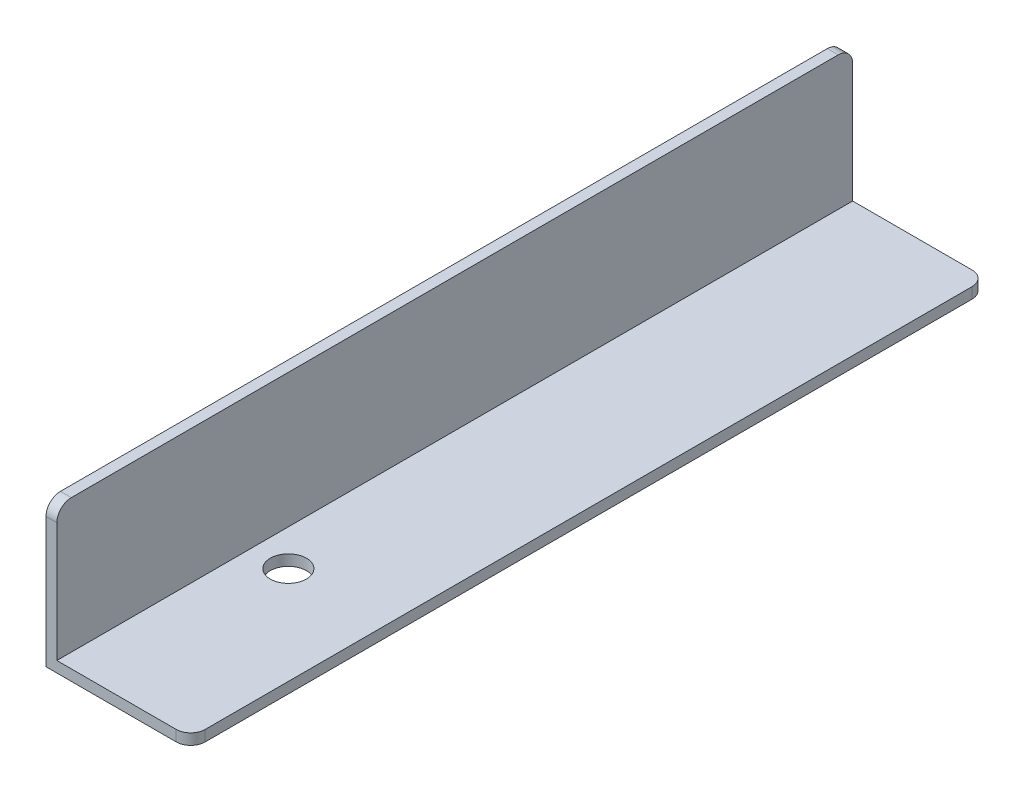
ISO-10303-21;
HEADER;
FILE_DESCRIPTION(('STEP AP214'),'2;1');
FILE_NAME('part.step','',(''),(''),'','','');
FILE_SCHEMA(('AUTOMOTIVE_DESIGN { 1 0 10303 214 1 1 1 1 }'));
ENDSEC;
DATA;
#1=APPLICATION_CONTEXT('core data for automotive mechanical design processes');
#2=APPLICATION_PROTOCOL_DEFINITION('international standard','automotive_design',2000,#1);
#3=PRODUCT_CONTEXT('',#1,'mechanical');
#4=PRODUCT('Part','Part','',(#3));
#5=PRODUCT_RELATED_PRODUCT_CATEGORY('part','',(#4));
#6=PRODUCT_DEFINITION_FORMATION('','',#4);
#7=PRODUCT_DEFINITION_CONTEXT('part definition',#1,'design');
#8=PRODUCT_DEFINITION('design','',#6,#7);
#9=PRODUCT_DEFINITION_SHAPE('','',#8);
#10=(LENGTH_UNIT() NAMED_UNIT(*) SI_UNIT(.MILLI.,.METRE.));
#11=(NAMED_UNIT(*) PLANE_ANGLE_UNIT() SI_UNIT($,.RADIAN.));
#12=(NAMED_UNIT(*) SI_UNIT($,.STERADIAN.) SOLID_ANGLE_UNIT());
#13=UNCERTAINTY_MEASURE_WITH_UNIT(LENGTH_MEASURE(1.E-05),#10,'distance_accuracy_value','');
#14=(GEOMETRIC_REPRESENTATION_CONTEXT(3) GLOBAL_UNCERTAINTY_ASSIGNED_CONTEXT((#13)) GLOBAL_UNIT_ASSIGNED_CONTEXT((#10,
#11,#12)) REPRESENTATION_CONTEXT('',''));
#15=CARTESIAN_POINT('',(0.,0.,0.));
#16=DIRECTION('',(0.,0.,1.));
#17=DIRECTION('',(1.,0.,0.));
#18=AXIS2_PLACEMENT_3D('',#15,#16,#17);
#19=CARTESIAN_POINT('',(0.,0.,-110.));
#20=DIRECTION('',(0.,-1.,0.));
#21=DIRECTION('',(0.,0.,-1.));
#22=AXIS2_PLACEMENT_3D('',#19,#20,#21);
#23=PLANE('',#22);
#24=CARTESIAN_POINT('',(6.5,0.,-27.));
#25=DIRECTION('',(0.,-1.,0.));
#26=DIRECTION('',(0.,0.,-1.));
#27=AXIS2_PLACEMENT_3D('',#24,#25,#26);
#28=CIRCLE('',#27,2.5);
#29=CARTESIAN_POINT('',(6.5,0.,-29.5));
#30=VERTEX_POINT('',#29);
#31=EDGE_CURVE('E166',#30,#30,#28,.T.);
#32=ORIENTED_EDGE('',*,*,#31,.F.);
#33=EDGE_LOOP('',(#32));
#34=FACE_BOUND('',#33,.T.);
#35=DIRECTION('',(1.,0.,0.));
#36=VECTOR('',#35,1.);
#37=CARTESIAN_POINT('',(0.,0.,-110.));
#38=LINE('',#37,#36);
#39=CARTESIAN_POINT('',(0.,0.,-110.));
#40=VERTEX_POINT('',#39);
#41=CARTESIAN_POINT('',(18.,0.,-110.));
#42=VERTEX_POINT('',#41);
#43=EDGE_CURVE('E136',#40,#42,#38,.T.);
#44=ORIENTED_EDGE('',*,*,#43,.T.);
#45=CARTESIAN_POINT('',(18.,0.,-108.));
#46=DIRECTION('',(0.,-1.,0.));
#47=DIRECTION('',(0.,0.,-1.));
#48=AXIS2_PLACEMENT_3D('',#45,#46,#47);
#49=CIRCLE('',#48,2.);
#50=CARTESIAN_POINT('',(20.,0.,-108.));
#51=VERTEX_POINT('',#50);
#52=EDGE_CURVE('E184',#42,#51,#49,.T.);
#53=ORIENTED_EDGE('',*,*,#52,.T.);
#54=DIRECTION('',(0.,0.,1.));
#55=VECTOR('',#54,1.);
#56=CARTESIAN_POINT('',(20.,0.,-110.));
#57=LINE('',#56,#55);
#58=CARTESIAN_POINT('',(20.,0.,-2.));
#59=VERTEX_POINT('',#58);
#60=EDGE_CURVE('E144',#51,#59,#57,.T.);
#61=ORIENTED_EDGE('',*,*,#60,.T.);
#62=CARTESIAN_POINT('',(18.,0.,-2.));
#63=DIRECTION('',(0.,-1.,0.));
#64=DIRECTION('',(0.,0.,-1.));
#65=AXIS2_PLACEMENT_3D('',#62,#63,#64);
#66=CIRCLE('',#65,2.);
#67=CARTESIAN_POINT('',(18.,0.,0.));
#68=VERTEX_POINT('',#67);
#69=EDGE_CURVE('E182',#59,#68,#66,.T.);
#70=ORIENTED_EDGE('',*,*,#69,.T.);
#71=DIRECTION('',(1.,0.,0.));
#72=VECTOR('',#71,1.);
#73=CARTESIAN_POINT('',(0.,0.,0.));
#74=LINE('',#73,#72);
#75=CARTESIAN_POINT('',(0.,0.,0.));
#76=VERTEX_POINT('',#75);
#77=EDGE_CURVE('E145',#76,#68,#74,.T.);
#78=ORIENTED_EDGE('',*,*,#77,.F.);
#79=DIRECTION('',(0.,0.,1.));
#80=VECTOR('',#79,1.);
#81=CARTESIAN_POINT('',(0.,0.,-110.));
#82=LINE('',#81,#80);
#83=EDGE_CURVE('E152',#40,#76,#82,.T.);
#84=ORIENTED_EDGE('',*,*,#83,.F.);
#85=EDGE_LOOP('',(#44,#53,#61,#70,#78,#84));
#86=FACE_BOUND('',#85,.T.);
#87=ADVANCED_FACE('F33',(#34,#86),#23,.T.);
#88=CARTESIAN_POINT('',(0.,20.,-110.));
#89=DIRECTION('',(-1.,0.,0.));
#90=DIRECTION('',(0.,-1.,0.));
#91=AXIS2_PLACEMENT_3D('',#88,#89,#90);
#92=PLANE('',#91);
#93=DIRECTION('',(0.,0.,1.));
#94=VECTOR('',#93,1.);
#95=CARTESIAN_POINT('',(0.,20.,-110.));
#96=LINE('',#95,#94);
#97=CARTESIAN_POINT('',(0.,20.,-108.));
#98=VERTEX_POINT('',#97);
#99=CARTESIAN_POINT('',(0.,20.,-2.));
#100=VERTEX_POINT('',#99);
#101=EDGE_CURVE('E156',#98,#100,#96,.T.);
#102=ORIENTED_EDGE('',*,*,#101,.F.);
#103=CARTESIAN_POINT('',(0.,18.,-108.));
#104=DIRECTION('',(-1.,0.,0.));
#105=DIRECTION('',(0.,-1.,0.));
#106=AXIS2_PLACEMENT_3D('',#103,#104,#105);
#107=CIRCLE('',#106,2.);
#108=CARTESIAN_POINT('',(0.,18.,-110.));
#109=VERTEX_POINT('',#108);
#110=EDGE_CURVE('E180',#98,#109,#107,.T.);
#111=ORIENTED_EDGE('',*,*,#110,.T.);
#112=DIRECTION('',(0.,-1.,0.));
#113=VECTOR('',#112,1.);
#114=CARTESIAN_POINT('',(0.,20.,-110.));
#115=LINE('',#114,#113);
#116=EDGE_CURVE('E123',#109,#40,#115,.T.);
#117=ORIENTED_EDGE('',*,*,#116,.T.);
#118=ORIENTED_EDGE('',*,*,#83,.T.);
#119=DIRECTION('',(0.,-1.,0.));
#120=VECTOR('',#119,1.);
#121=CARTESIAN_POINT('',(0.,20.,0.));
#122=LINE('',#121,#120);
#123=CARTESIAN_POINT('',(0.,18.,0.));
#124=VERTEX_POINT('',#123);
#125=EDGE_CURVE('E139',#124,#76,#122,.T.);
#126=ORIENTED_EDGE('',*,*,#125,.F.);
#127=CARTESIAN_POINT('',(0.,18.,-2.));
#128=DIRECTION('',(-1.,0.,0.));
#129=DIRECTION('',(0.,-1.,0.));
#130=AXIS2_PLACEMENT_3D('',#127,#128,#129);
#131=CIRCLE('',#130,2.);
#132=EDGE_CURVE('E178',#124,#100,#131,.T.);
#133=ORIENTED_EDGE('',*,*,#132,.T.);
#134=EDGE_LOOP('',(#102,#111,#117,#118,#126,#133));
#135=FACE_BOUND('',#134,.T.);
#136=ADVANCED_FACE('F199',(#135),#92,.T.);
#137=CARTESIAN_POINT('',(0.,20.,-110.));
#138=DIRECTION('',(0.,-1.,0.));
#139=DIRECTION('',(0.,0.,-1.));
#140=AXIS2_PLACEMENT_3D('',#137,#138,#139);
#141=PLANE('',#140);
#142=DIRECTION('',(0.,0.,1.));
#143=VECTOR('',#142,1.);
#144=CARTESIAN_POINT('',(1.5,20.,-110.));
#145=LINE('',#144,#143);
#146=CARTESIAN_POINT('',(1.5,20.,-108.));
#147=VERTEX_POINT('',#146);
#148=CARTESIAN_POINT('',(1.5,20.,-2.));
#149=VERTEX_POINT('',#148);
#150=EDGE_CURVE('E130',#147,#149,#145,.T.);
#151=ORIENTED_EDGE('',*,*,#150,.F.);
#152=DIRECTION('',(1.,0.,0.));
#153=VECTOR('',#152,1.);
#154=CARTESIAN_POINT('',(0.,20.,-108.));
#155=LINE('',#154,#153);
#156=EDGE_CURVE('E176',#147,#98,#155,.F.);
#157=ORIENTED_EDGE('',*,*,#156,.T.);
#158=ORIENTED_EDGE('',*,*,#101,.T.);
#159=DIRECTION('',(1.,0.,0.));
#160=VECTOR('',#159,1.);
#161=CARTESIAN_POINT('',(0.,20.,-2.));
#162=LINE('',#161,#160);
#163=EDGE_CURVE('E173',#100,#149,#162,.T.);
#164=ORIENTED_EDGE('',*,*,#163,.T.);
#165=EDGE_LOOP('',(#151,#157,#158,#164));
#166=FACE_BOUND('',#165,.T.);
#167=ADVANCED_FACE('F205',(#166),#141,.F.);
#168=CARTESIAN_POINT('',(1.5,20.,-110.));
#169=DIRECTION('',(-1.,0.,0.));
#170=DIRECTION('',(0.,-1.,0.));
#171=AXIS2_PLACEMENT_3D('',#168,#169,#170);
#172=PLANE('',#171);
#173=DIRECTION('',(0.,-1.,0.));
#174=VECTOR('',#173,1.);
#175=CARTESIAN_POINT('',(1.5,20.,-110.));
#176=LINE('',#175,#174);
#177=CARTESIAN_POINT('',(1.5,18.,-110.));
#178=VERTEX_POINT('',#177);
#179=CARTESIAN_POINT('',(1.5,1.5,-110.));
#180=VERTEX_POINT('',#179);
#181=EDGE_CURVE('E112',#178,#180,#176,.T.);
#182=ORIENTED_EDGE('',*,*,#181,.F.);
#183=CARTESIAN_POINT('',(1.5,18.,-108.));
#184=DIRECTION('',(-1.,0.,0.));
#185=DIRECTION('',(0.,-1.,0.));
#186=AXIS2_PLACEMENT_3D('',#183,#184,#185);
#187=CIRCLE('',#186,2.);
#188=EDGE_CURVE('E171',#178,#147,#187,.F.);
#189=ORIENTED_EDGE('',*,*,#188,.T.);
#190=ORIENTED_EDGE('',*,*,#150,.T.);
#191=CARTESIAN_POINT('',(1.5,18.,-2.));
#192=DIRECTION('',(-1.,0.,0.));
#193=DIRECTION('',(0.,-1.,0.));
#194=AXIS2_PLACEMENT_3D('',#191,#192,#193);
#195=CIRCLE('',#194,2.);
#196=CARTESIAN_POINT('',(1.5,18.,0.));
#197=VERTEX_POINT('',#196);
#198=EDGE_CURVE('E169',#149,#197,#195,.F.);
#199=ORIENTED_EDGE('',*,*,#198,.T.);
#200=DIRECTION('',(0.,-1.,0.));
#201=VECTOR('',#200,1.);
#202=CARTESIAN_POINT('',(1.5,20.,0.));
#203=LINE('',#202,#201);
#204=CARTESIAN_POINT('',(1.5,1.5,0.));
#205=VERTEX_POINT('',#204);
#206=EDGE_CURVE('E129',#197,#205,#203,.T.);
#207=ORIENTED_EDGE('',*,*,#206,.T.);
#208=DIRECTION('',(0.,0.,1.));
#209=VECTOR('',#208,1.);
#210=CARTESIAN_POINT('',(1.5,1.5,-110.));
#211=LINE('',#210,#209);
#212=EDGE_CURVE('E126',#180,#205,#211,.T.);
#213=ORIENTED_EDGE('',*,*,#212,.F.);
#214=EDGE_LOOP('',(#182,#189,#190,#199,#207,#213));
#215=FACE_BOUND('',#214,.T.);
#216=ADVANCED_FACE('F127',(#215),#172,.F.);
#217=CARTESIAN_POINT('',(0.,1.5,-110.));
#218=DIRECTION('',(0.,-1.,0.));
#219=DIRECTION('',(0.,0.,-1.));
#220=AXIS2_PLACEMENT_3D('',#217,#218,#219);
#221=PLANE('',#220);
#222=CARTESIAN_POINT('',(6.5,1.5,-27.));
#223=DIRECTION('',(0.,-1.,0.));
#224=DIRECTION('',(0.,0.,-1.));
#225=AXIS2_PLACEMENT_3D('',#222,#223,#224);
#226=CIRCLE('',#225,2.5);
#227=CARTESIAN_POINT('',(6.5,1.5,-29.5));
#228=VERTEX_POINT('',#227);
#229=EDGE_CURVE('E148',#228,#228,#226,.T.);
#230=ORIENTED_EDGE('',*,*,#229,.T.);
#231=EDGE_LOOP('',(#230));
#232=FACE_BOUND('',#231,.T.);
#233=DIRECTION('',(0.,0.,1.));
#234=VECTOR('',#233,1.);
#235=CARTESIAN_POINT('',(20.,1.5,-110.));
#236=LINE('',#235,#234);
#237=CARTESIAN_POINT('',(20.,1.5,-108.));
#238=VERTEX_POINT('',#237);
#239=CARTESIAN_POINT('',(20.,1.5,-2.));
#240=VERTEX_POINT('',#239);
#241=EDGE_CURVE('E131',#238,#240,#236,.T.);
#242=ORIENTED_EDGE('',*,*,#241,.F.);
#243=CARTESIAN_POINT('',(18.,1.5,-108.));
#244=DIRECTION('',(0.,-1.,0.));
#245=DIRECTION('',(0.,0.,-1.));
#246=AXIS2_PLACEMENT_3D('',#243,#244,#245);
#247=CIRCLE('',#246,2.);
#248=CARTESIAN_POINT('',(18.,1.5,-110.));
#249=VERTEX_POINT('',#248);
#250=EDGE_CURVE('E135',#238,#249,#247,.F.);
#251=ORIENTED_EDGE('',*,*,#250,.T.);
#252=DIRECTION('',(1.,0.,0.));
#253=VECTOR('',#252,1.);
#254=CARTESIAN_POINT('',(0.,1.5,-110.));
#255=LINE('',#254,#253);
#256=EDGE_CURVE('E118',#180,#249,#255,.T.);
#257=ORIENTED_EDGE('',*,*,#256,.F.);
#258=ORIENTED_EDGE('',*,*,#212,.T.);
#259=DIRECTION('',(1.,0.,0.));
#260=VECTOR('',#259,1.);
#261=CARTESIAN_POINT('',(0.,1.5,0.));
#262=LINE('',#261,#260);
#263=CARTESIAN_POINT('',(18.,1.5,0.));
#264=VERTEX_POINT('',#263);
#265=EDGE_CURVE('E147',#205,#264,#262,.T.);
#266=ORIENTED_EDGE('',*,*,#265,.T.);
#267=CARTESIAN_POINT('',(18.,1.5,-2.));
#268=DIRECTION('',(0.,-1.,0.));
#269=DIRECTION('',(0.,0.,-1.));
#270=AXIS2_PLACEMENT_3D('',#267,#268,#269);
#271=CIRCLE('',#270,2.);
#272=EDGE_CURVE('E53',#264,#240,#271,.F.);
#273=ORIENTED_EDGE('',*,*,#272,.T.);
#274=EDGE_LOOP('',(#242,#251,#257,#258,#266,#273));
#275=FACE_BOUND('',#274,.T.);
#276=ADVANCED_FACE('F133',(#232,#275),#221,.F.);
#277=CARTESIAN_POINT('',(20.,1.5,-110.));
#278=DIRECTION('',(-1.,0.,0.));
#279=DIRECTION('',(0.,0.,1.));
#280=AXIS2_PLACEMENT_3D('',#277,#278,#279);
#281=PLANE('',#280);
#282=ORIENTED_EDGE('',*,*,#60,.F.);
#283=DIRECTION('',(0.,-1.,0.));
#284=VECTOR('',#283,1.);
#285=CARTESIAN_POINT('',(20.,1.5,-108.));
#286=LINE('',#285,#284);
#287=EDGE_CURVE('E189',#51,#238,#286,.F.);
#288=ORIENTED_EDGE('',*,*,#287,.T.);
#289=ORIENTED_EDGE('',*,*,#241,.T.);
#290=DIRECTION('',(0.,-1.,0.));
#291=VECTOR('',#290,1.);
#292=CARTESIAN_POINT('',(20.,1.5,-2.));
#293=LINE('',#292,#291);
#294=EDGE_CURVE('E186',#240,#59,#293,.T.);
#295=ORIENTED_EDGE('',*,*,#294,.T.);
#296=EDGE_LOOP('',(#282,#288,#289,#295));
#297=FACE_BOUND('',#296,.T.);
#298=ADVANCED_FACE('F217',(#297),#281,.F.);
#299=CARTESIAN_POINT('',(20.,0.,-110.));
#300=DIRECTION('',(0.,0.,-1.));
#301=DIRECTION('',(-1.,0.,0.));
#302=AXIS2_PLACEMENT_3D('',#299,#300,#301);
#303=PLANE('',#302);
#304=ORIENTED_EDGE('',*,*,#116,.F.);
#305=DIRECTION('',(1.,0.,0.));
#306=VECTOR('',#305,1.);
#307=CARTESIAN_POINT('',(1.5,18.,-110.));
#308=LINE('',#307,#306);
#309=EDGE_CURVE('E121',#109,#178,#308,.T.);
#310=ORIENTED_EDGE('',*,*,#309,.T.);
#311=ORIENTED_EDGE('',*,*,#181,.T.);
#312=ORIENTED_EDGE('',*,*,#256,.T.);
#313=DIRECTION('',(0.,-1.,0.));
#314=VECTOR('',#313,1.);
#315=CARTESIAN_POINT('',(18.,0.,-110.));
#316=LINE('',#315,#314);
#317=EDGE_CURVE('E155',#249,#42,#316,.T.);
#318=ORIENTED_EDGE('',*,*,#317,.T.);
#319=ORIENTED_EDGE('',*,*,#43,.F.);
#320=EDGE_LOOP('',(#304,#310,#311,#312,#318,#319));
#321=FACE_BOUND('',#320,.T.);
#322=ADVANCED_FACE('F115',(#321),#303,.T.);
#323=CARTESIAN_POINT('',(20.,0.,0.));
#324=DIRECTION('',(0.,0.,-1.));
#325=DIRECTION('',(-1.,0.,0.));
#326=AXIS2_PLACEMENT_3D('',#323,#324,#325);
#327=PLANE('',#326);
#328=ORIENTED_EDGE('',*,*,#77,.T.);
#329=DIRECTION('',(0.,-1.,0.));
#330=VECTOR('',#329,1.);
#331=CARTESIAN_POINT('',(18.,0.,0.));
#332=LINE('',#331,#330);
#333=EDGE_CURVE('E11',#68,#264,#332,.F.);
#334=ORIENTED_EDGE('',*,*,#333,.T.);
#335=ORIENTED_EDGE('',*,*,#265,.F.);
#336=ORIENTED_EDGE('',*,*,#206,.F.);
#337=DIRECTION('',(1.,0.,0.));
#338=VECTOR('',#337,1.);
#339=CARTESIAN_POINT('',(20.,18.,0.));
#340=LINE('',#339,#338);
#341=EDGE_CURVE('E41',#197,#124,#340,.F.);
#342=ORIENTED_EDGE('',*,*,#341,.T.);
#343=ORIENTED_EDGE('',*,*,#125,.T.);
#344=EDGE_LOOP('',(#328,#334,#335,#336,#342,#343));
#345=FACE_BOUND('',#344,.T.);
#346=ADVANCED_FACE('F194',(#345),#327,.F.);
#347=CARTESIAN_POINT('',(6.5,17.,-27.));
#348=DIRECTION('',(0.,-1.,0.));
#349=DIRECTION('',(0.,0.,-1.));
#350=AXIS2_PLACEMENT_3D('',#347,#348,#349);
#351=CYLINDRICAL_SURFACE('',#350,2.5);
#352=ORIENTED_EDGE('',*,*,#31,.T.);
#353=EDGE_LOOP('',(#352));
#354=FACE_BOUND('',#353,.T.);
#355=ORIENTED_EDGE('',*,*,#229,.F.);
#356=EDGE_LOOP('',(#355));
#357=FACE_BOUND('',#356,.T.);
#358=ADVANCED_FACE('F227',(#354,#357),#351,.F.);
#359=CARTESIAN_POINT('',(20.,18.,-108.));
#360=DIRECTION('',(-1.,0.,0.));
#361=DIRECTION('',(0.,0.,1.));
#362=AXIS2_PLACEMENT_3D('',#359,#360,#361);
#363=CYLINDRICAL_SURFACE('',#362,2.);
#364=ORIENTED_EDGE('',*,*,#110,.F.);
#365=ORIENTED_EDGE('',*,*,#156,.F.);
#366=ORIENTED_EDGE('',*,*,#188,.F.);
#367=ORIENTED_EDGE('',*,*,#309,.F.);
#368=EDGE_LOOP('',(#364,#365,#366,#367));
#369=FACE_BOUND('',#368,.T.);
#370=ADVANCED_FACE('F209',(#369),#363,.T.);
#371=CARTESIAN_POINT('',(18.,0.,-108.));
#372=DIRECTION('',(0.,1.,0.));
#373=DIRECTION('',(0.,0.,1.));
#374=AXIS2_PLACEMENT_3D('',#371,#372,#373);
#375=CYLINDRICAL_SURFACE('',#374,2.);
#376=ORIENTED_EDGE('',*,*,#250,.F.);
#377=ORIENTED_EDGE('',*,*,#287,.F.);
#378=ORIENTED_EDGE('',*,*,#52,.F.);
#379=ORIENTED_EDGE('',*,*,#317,.F.);
#380=EDGE_LOOP('',(#376,#377,#378,#379));
#381=FACE_BOUND('',#380,.T.);
#382=ADVANCED_FACE('F220',(#381),#375,.T.);
#383=CARTESIAN_POINT('',(18.,1.5,-2.));
#384=DIRECTION('',(0.,-1.,0.));
#385=DIRECTION('',(0.,0.,-1.));
#386=AXIS2_PLACEMENT_3D('',#383,#384,#385);
#387=CYLINDRICAL_SURFACE('',#386,2.);
#388=ORIENTED_EDGE('',*,*,#272,.F.);
#389=ORIENTED_EDGE('',*,*,#333,.F.);
#390=ORIENTED_EDGE('',*,*,#69,.F.);
#391=ORIENTED_EDGE('',*,*,#294,.F.);
#392=EDGE_LOOP('',(#388,#389,#390,#391));
#393=FACE_BOUND('',#392,.T.);
#394=ADVANCED_FACE('F214',(#393),#387,.T.);
#395=CARTESIAN_POINT('',(0.,18.,-2.));
#396=DIRECTION('',(1.,0.,0.));
#397=DIRECTION('',(0.,0.,-1.));
#398=AXIS2_PLACEMENT_3D('',#395,#396,#397);
#399=CYLINDRICAL_SURFACE('',#398,2.);
#400=ORIENTED_EDGE('',*,*,#132,.F.);
#401=ORIENTED_EDGE('',*,*,#341,.F.);
#402=ORIENTED_EDGE('',*,*,#198,.F.);
#403=ORIENTED_EDGE('',*,*,#163,.F.);
#404=EDGE_LOOP('',(#400,#401,#402,#403));
#405=FACE_BOUND('',#404,.T.);
#406=ADVANCED_FACE('F35',(#405),#399,.T.);
#407=CLOSED_SHELL('',(#87,#136,#167,#216,#276,#298,#322,#346,#358,#370,#382,#394,#406));
#408=MANIFOLD_SOLID_BREP('B2',#407);
#409=ADVANCED_BREP_SHAPE_REPRESENTATION('',(#18,#408),#14);
#410=SHAPE_DEFINITION_REPRESENTATION(#9,#409);
ENDSEC;
END-ISO-10303-21;
